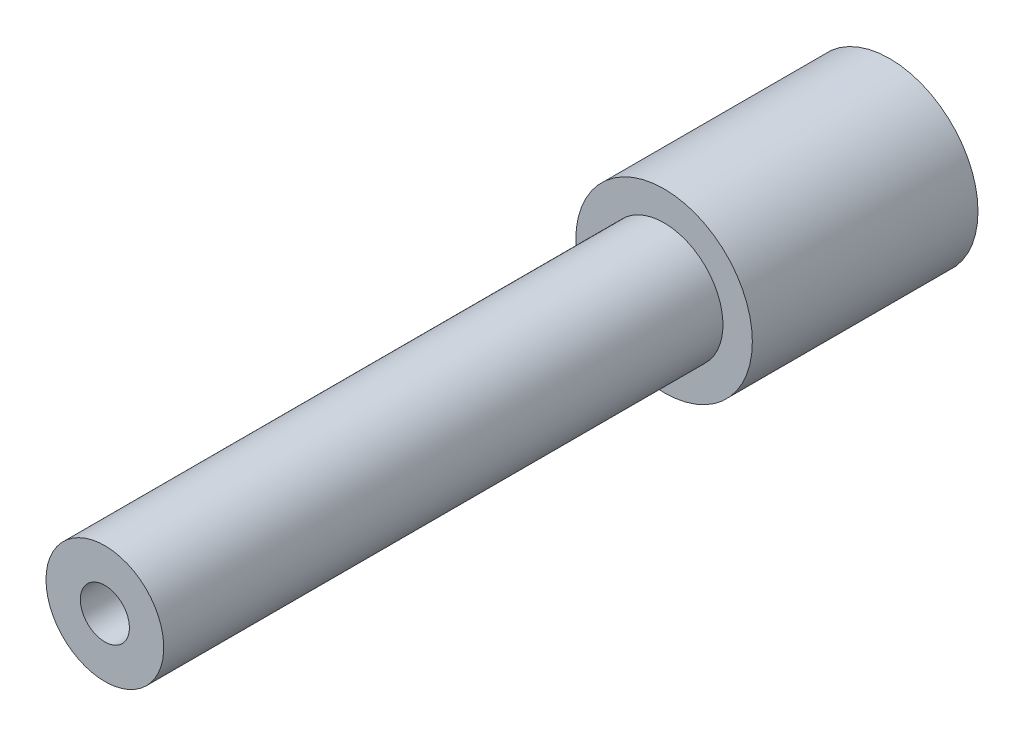
ISO-10303-21;
HEADER;
FILE_DESCRIPTION(('STEP AP214'),'2;1');
FILE_NAME('part.step','',(''),(''),'','','');
FILE_SCHEMA(('AUTOMOTIVE_DESIGN { 1 0 10303 214 1 1 1 1 }'));
ENDSEC;
DATA;
#1=APPLICATION_CONTEXT('core data for automotive mechanical design processes');
#2=APPLICATION_PROTOCOL_DEFINITION('international standard','automotive_design',2000,#1);
#3=PRODUCT_CONTEXT('',#1,'mechanical');
#4=PRODUCT('Part','Part','',(#3));
#5=PRODUCT_RELATED_PRODUCT_CATEGORY('part','',(#4));
#6=PRODUCT_DEFINITION_FORMATION('','',#4);
#7=PRODUCT_DEFINITION_CONTEXT('part definition',#1,'design');
#8=PRODUCT_DEFINITION('design','',#6,#7);
#9=PRODUCT_DEFINITION_SHAPE('','',#8);
#10=(LENGTH_UNIT() NAMED_UNIT(*) SI_UNIT(.MILLI.,.METRE.));
#11=(NAMED_UNIT(*) PLANE_ANGLE_UNIT() SI_UNIT($,.RADIAN.));
#12=(NAMED_UNIT(*) SI_UNIT($,.STERADIAN.) SOLID_ANGLE_UNIT());
#13=UNCERTAINTY_MEASURE_WITH_UNIT(LENGTH_MEASURE(1.E-05),#10,'distance_accuracy_value','');
#14=(GEOMETRIC_REPRESENTATION_CONTEXT(3) GLOBAL_UNCERTAINTY_ASSIGNED_CONTEXT((#13)) GLOBAL_UNIT_ASSIGNED_CONTEXT((#10,
#11,#12)) REPRESENTATION_CONTEXT('',''));
#15=CARTESIAN_POINT('',(0.,0.,0.));
#16=DIRECTION('',(0.,0.,1.));
#17=DIRECTION('',(1.,0.,0.));
#18=AXIS2_PLACEMENT_3D('',#15,#16,#17);
#19=CARTESIAN_POINT('',(0.,0.,11.5));
#20=DIRECTION('',(0.,0.,-1.));
#21=DIRECTION('',(-1.,0.,0.));
#22=AXIS2_PLACEMENT_3D('',#19,#20,#21);
#23=CYLINDRICAL_SURFACE('',#22,4.5);
#24=CARTESIAN_POINT('',(0.,0.,11.5));
#25=DIRECTION('',(0.,0.,1.));
#26=DIRECTION('',(1.,0.,0.));
#27=AXIS2_PLACEMENT_3D('',#24,#25,#26);
#28=CIRCLE('',#27,4.5);
#29=CARTESIAN_POINT('',(4.5,0.,11.5));
#30=VERTEX_POINT('',#29);
#31=EDGE_CURVE('E10',#30,#30,#28,.T.);
#32=ORIENTED_EDGE('',*,*,#31,.F.);
#33=EDGE_LOOP('',(#32));
#34=FACE_BOUND('',#33,.T.);
#35=CARTESIAN_POINT('',(0.,0.,0.));
#36=DIRECTION('',(0.,0.,1.));
#37=DIRECTION('',(1.,0.,0.));
#38=AXIS2_PLACEMENT_3D('',#35,#36,#37);
#39=CIRCLE('',#38,4.5);
#40=CARTESIAN_POINT('',(4.5,0.,0.));
#41=VERTEX_POINT('',#40);
#42=EDGE_CURVE('E33',#41,#41,#39,.T.);
#43=ORIENTED_EDGE('',*,*,#42,.T.);
#44=EDGE_LOOP('',(#43));
#45=FACE_BOUND('',#44,.T.);
#46=ADVANCED_FACE('F30',(#34,#45),#23,.T.);
#47=CARTESIAN_POINT('',(0.,0.,11.5));
#48=DIRECTION('',(0.,0.,1.));
#49=DIRECTION('',(1.,0.,0.));
#50=AXIS2_PLACEMENT_3D('',#47,#48,#49);
#51=PLANE('',#50);
#52=CARTESIAN_POINT('',(0.,0.,11.5));
#53=DIRECTION('',(0.,0.,1.));
#54=DIRECTION('',(1.,0.,0.));
#55=AXIS2_PLACEMENT_3D('',#52,#53,#54);
#56=CIRCLE('',#55,3.);
#57=CARTESIAN_POINT('',(-3.,0.,11.5));
#58=VERTEX_POINT('',#57);
#59=EDGE_CURVE('E42',#58,#58,#56,.T.);
#60=ORIENTED_EDGE('',*,*,#59,.F.);
#61=EDGE_LOOP('',(#60));
#62=FACE_BOUND('',#61,.T.);
#63=ORIENTED_EDGE('',*,*,#31,.T.);
#64=EDGE_LOOP('',(#63));
#65=FACE_BOUND('',#64,.T.);
#66=ADVANCED_FACE('F75',(#62,#65),#51,.T.);
#67=CARTESIAN_POINT('',(0.,0.,0.));
#68=DIRECTION('',(0.,0.,1.));
#69=DIRECTION('',(1.,0.,0.));
#70=AXIS2_PLACEMENT_3D('',#67,#68,#69);
#71=PLANE('',#70);
#72=ORIENTED_EDGE('',*,*,#42,.F.);
#73=EDGE_LOOP('',(#72));
#74=FACE_BOUND('',#73,.T.);
#75=ADVANCED_FACE('F71',(#74),#71,.F.);
#76=CARTESIAN_POINT('',(0.,0.,40.));
#77=DIRECTION('',(0.,0.,-1.));
#78=DIRECTION('',(-1.,0.,0.));
#79=AXIS2_PLACEMENT_3D('',#76,#77,#78);
#80=CYLINDRICAL_SURFACE('',#79,3.);
#81=CARTESIAN_POINT('',(0.,0.,40.));
#82=DIRECTION('',(0.,0.,1.));
#83=DIRECTION('',(1.,0.,0.));
#84=AXIS2_PLACEMENT_3D('',#81,#82,#83);
#85=CIRCLE('',#84,3.);
#86=CARTESIAN_POINT('',(-3.,0.,40.));
#87=VERTEX_POINT('',#86);
#88=EDGE_CURVE('E40',#87,#87,#85,.T.);
#89=CARTESIAN_POINT('',(-3.,0.,40.));
#90=CARTESIAN_POINT('',(-3.,0.,39.703125));
#91=CARTESIAN_POINT('',(-3.,0.,39.40625));
#92=CARTESIAN_POINT('',(-3.,0.,38.8125));
#93=CARTESIAN_POINT('',(-3.,0.,38.515625));
#94=CARTESIAN_POINT('',(-3.,0.,37.921875));
#95=CARTESIAN_POINT('',(-3.,0.,37.625));
#96=CARTESIAN_POINT('',(-3.,0.,37.03125));
#97=CARTESIAN_POINT('',(-3.,0.,36.734375));
#98=CARTESIAN_POINT('',(-3.,0.,36.140625));
#99=CARTESIAN_POINT('',(-3.,0.,35.84375));
#100=CARTESIAN_POINT('',(-3.,0.,35.25));
#101=CARTESIAN_POINT('',(-3.,0.,34.953125));
#102=CARTESIAN_POINT('',(-3.,0.,34.359375));
#103=CARTESIAN_POINT('',(-3.,0.,34.0625));
#104=CARTESIAN_POINT('',(-3.,0.,33.46875));
#105=CARTESIAN_POINT('',(-3.,0.,33.171875));
#106=CARTESIAN_POINT('',(-3.,0.,32.578125));
#107=CARTESIAN_POINT('',(-3.,0.,32.28125));
#108=CARTESIAN_POINT('',(-3.,0.,31.6875));
#109=CARTESIAN_POINT('',(-3.,0.,31.390625));
#110=CARTESIAN_POINT('',(-3.,0.,30.796875));
#111=CARTESIAN_POINT('',(-3.,0.,30.5));
#112=CARTESIAN_POINT('',(-3.,0.,29.90625));
#113=CARTESIAN_POINT('',(-3.,0.,29.609375));
#114=CARTESIAN_POINT('',(-3.,0.,29.015625));
#115=CARTESIAN_POINT('',(-3.,0.,28.71875));
#116=CARTESIAN_POINT('',(-3.,0.,28.125));
#117=CARTESIAN_POINT('',(-3.,0.,27.828125));
#118=CARTESIAN_POINT('',(-3.,0.,27.234375));
#119=CARTESIAN_POINT('',(-3.,0.,26.9375));
#120=CARTESIAN_POINT('',(-3.,0.,26.34375));
#121=CARTESIAN_POINT('',(-3.,0.,26.046875));
#122=CARTESIAN_POINT('',(-3.,0.,25.453125));
#123=CARTESIAN_POINT('',(-3.,0.,25.15625));
#124=CARTESIAN_POINT('',(-3.,0.,24.5625));
#125=CARTESIAN_POINT('',(-3.,0.,24.265625));
#126=CARTESIAN_POINT('',(-3.,0.,23.671875));
#127=CARTESIAN_POINT('',(-3.,0.,23.375));
#128=CARTESIAN_POINT('',(-3.,0.,22.78125));
#129=CARTESIAN_POINT('',(-3.,0.,22.484375));
#130=CARTESIAN_POINT('',(-3.,0.,21.890625));
#131=CARTESIAN_POINT('',(-3.,0.,21.59375));
#132=CARTESIAN_POINT('',(-3.,0.,21.));
#133=CARTESIAN_POINT('',(-3.,0.,20.703125));
#134=CARTESIAN_POINT('',(-3.,0.,20.109375));
#135=CARTESIAN_POINT('',(-3.,0.,19.8125));
#136=CARTESIAN_POINT('',(-3.,0.,19.21875));
#137=CARTESIAN_POINT('',(-3.,0.,18.921875));
#138=CARTESIAN_POINT('',(-3.,0.,18.328125));
#139=CARTESIAN_POINT('',(-3.,0.,18.03125));
#140=CARTESIAN_POINT('',(-3.,0.,17.4375));
#141=CARTESIAN_POINT('',(-3.,0.,17.140625));
#142=CARTESIAN_POINT('',(-3.,0.,16.546875));
#143=CARTESIAN_POINT('',(-3.,0.,16.25));
#144=CARTESIAN_POINT('',(-3.,0.,15.65625));
#145=CARTESIAN_POINT('',(-3.,0.,15.359375));
#146=CARTESIAN_POINT('',(-3.,0.,14.765625));
#147=CARTESIAN_POINT('',(-3.,0.,14.46875));
#148=CARTESIAN_POINT('',(-3.,0.,13.875));
#149=CARTESIAN_POINT('',(-3.,0.,13.578125));
#150=CARTESIAN_POINT('',(-3.,0.,12.984375));
#151=CARTESIAN_POINT('',(-3.,0.,12.6875));
#152=CARTESIAN_POINT('',(-3.,0.,12.09375));
#153=CARTESIAN_POINT('',(-3.,0.,11.796875));
#154=CARTESIAN_POINT('',(-3.,0.,11.5));
#155=B_SPLINE_CURVE_WITH_KNOTS('',3,(#89,#90,#91,#92,#93,#94,#95,#96,#97,#98,#99,#100,#101,#102,
#103,#104,#105,#106,#107,#108,#109,#110,#111,#112,#113,#114,#115,#116,#117,#118,#119,#120,#121,
#122,#123,#124,#125,#126,#127,#128,#129,#130,#131,#132,#133,#134,#135,#136,#137,#138,#139,#140,
#141,#142,#143,#144,#145,#146,#147,#148,#149,#150,#151,#152,#153,#154),.UNSPECIFIED.,.F.,.F.,(4,
2,2,2,2,2,2,2,2,2,2,2,2,2,2,2,2,2,2,2,2,2,2,2,2,2,2,2,2,2,2,2,4),(0.,0.890624999999999,1.78125,
2.671875,3.5625,4.453125,5.34374999999999,6.23437499999999,7.12499999999999,8.015625,8.90625,
9.796875,10.6875,11.578125,12.46875,13.359375,14.25,15.140625,16.03125,16.921875,17.8125,
18.703125,19.59375,20.484375,21.375,22.265625,23.15625,24.046875,24.9375,25.828125,26.71875,
27.609375,28.5),.UNSPECIFIED.);
#156=EDGE_CURVE('BSEAM65',#87,#58,#155,.T.);
#157=ORIENTED_EDGE('',*,*,#88,.F.);
#158=ORIENTED_EDGE('',*,*,#59,.T.);
#159=ORIENTED_EDGE('',*,*,#156,.T.);
#160=ORIENTED_EDGE('',*,*,#156,.F.);
#161=EDGE_LOOP('',(#157,#159,#158,#160));
#162=FACE_BOUND('',#161,.T.);
#163=ADVANCED_FACE('F65',(#162),#80,.T.);
#164=CARTESIAN_POINT('',(0.,0.,40.));
#165=DIRECTION('',(0.,0.,1.));
#166=DIRECTION('',(1.,0.,0.));
#167=AXIS2_PLACEMENT_3D('',#164,#165,#166);
#168=PLANE('',#167);
#169=CARTESIAN_POINT('',(0.,0.,40.));
#170=DIRECTION('',(0.,0.,1.));
#171=DIRECTION('',(1.,0.,0.));
#172=AXIS2_PLACEMENT_3D('',#169,#170,#171);
#173=CIRCLE('',#172,1.25);
#174=CARTESIAN_POINT('',(1.25,0.,40.));
#175=VERTEX_POINT('',#174);
#176=EDGE_CURVE('E48',#175,#175,#173,.T.);
#177=ORIENTED_EDGE('',*,*,#176,.F.);
#178=EDGE_LOOP('',(#177));
#179=FACE_BOUND('',#178,.T.);
#180=ORIENTED_EDGE('',*,*,#88,.T.);
#181=EDGE_LOOP('',(#180));
#182=FACE_BOUND('',#181,.T.);
#183=ADVANCED_FACE('F59',(#179,#182),#168,.T.);
#184=CARTESIAN_POINT('',(0.,0.,33.));
#185=DIRECTION('',(0.,0.,1.));
#186=DIRECTION('',(1.,0.,0.));
#187=AXIS2_PLACEMENT_3D('',#184,#185,#186);
#188=CYLINDRICAL_SURFACE('',#187,1.25);
#189=CARTESIAN_POINT('',(0.,0.,33.));
#190=DIRECTION('',(0.,0.,1.));
#191=DIRECTION('',(1.,0.,0.));
#192=AXIS2_PLACEMENT_3D('',#189,#190,#191);
#193=CIRCLE('',#192,1.25);
#194=CARTESIAN_POINT('',(1.25,0.,33.));
#195=VERTEX_POINT('',#194);
#196=EDGE_CURVE('E45',#195,#195,#193,.T.);
#197=ORIENTED_EDGE('',*,*,#196,.F.);
#198=EDGE_LOOP('',(#197));
#199=FACE_BOUND('',#198,.T.);
#200=ORIENTED_EDGE('',*,*,#176,.T.);
#201=EDGE_LOOP('',(#200));
#202=FACE_BOUND('',#201,.T.);
#203=ADVANCED_FACE('F56',(#199,#202),#188,.F.);
#204=CARTESIAN_POINT('',(0.,0.,33.));
#205=DIRECTION('',(0.,0.,1.));
#206=DIRECTION('',(1.,0.,0.));
#207=AXIS2_PLACEMENT_3D('',#204,#205,#206);
#208=PLANE('',#207);
#209=ORIENTED_EDGE('',*,*,#196,.T.);
#210=EDGE_LOOP('',(#209));
#211=FACE_BOUND('',#210,.T.);
#212=ADVANCED_FACE('F54',(#211),#208,.T.);
#213=CLOSED_SHELL('',(#46,#66,#75,#163,#183,#203,#212));
#214=MANIFOLD_SOLID_BREP('B2',#213);
#215=ADVANCED_BREP_SHAPE_REPRESENTATION('',(#18,#214),#14);
#216=SHAPE_DEFINITION_REPRESENTATION(#9,#215);
ENDSEC;
END-ISO-10303-21;
